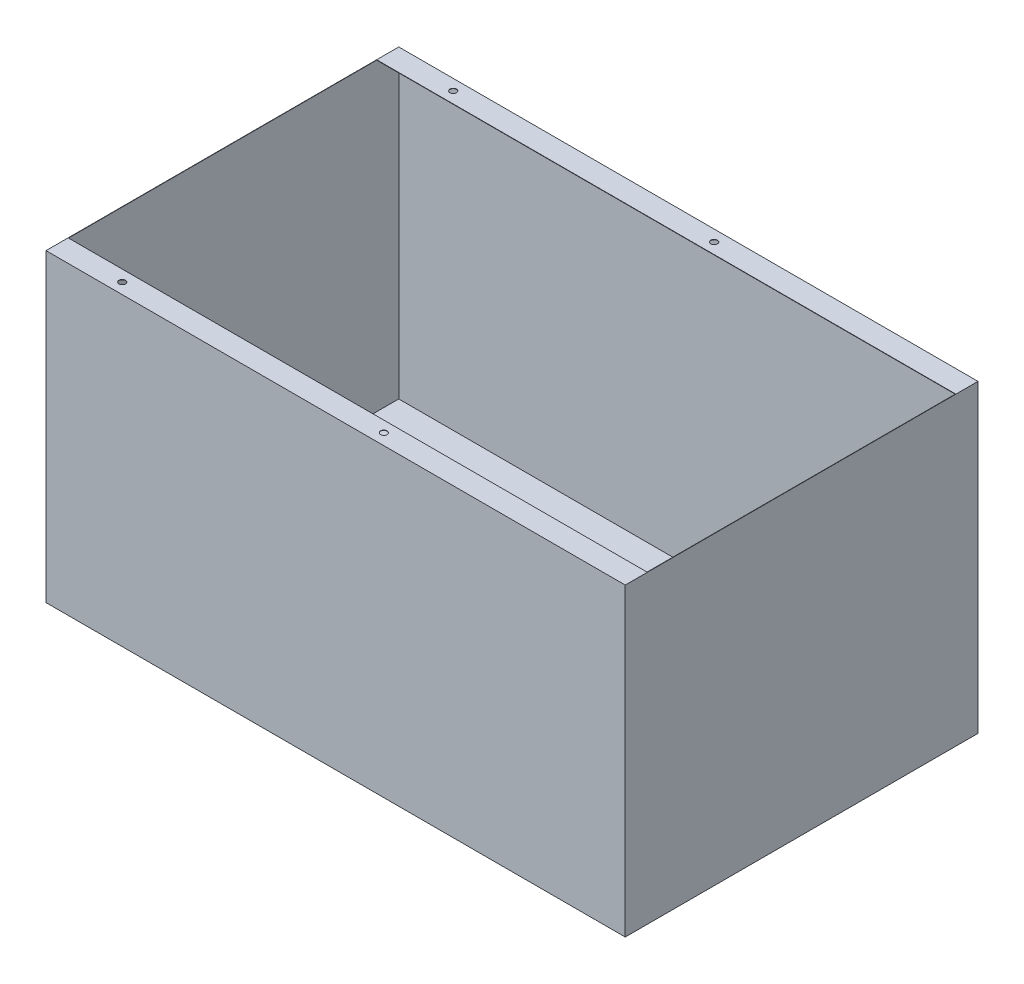
ISO-10303-21;
HEADER;
FILE_DESCRIPTION(('STEP AP214'),'2;1');
FILE_NAME('part.step','',(''),(''),'','','');
FILE_SCHEMA(('AUTOMOTIVE_DESIGN { 1 0 10303 214 1 1 1 1 }'));
ENDSEC;
DATA;
#1=APPLICATION_CONTEXT('core data for automotive mechanical design processes');
#2=APPLICATION_PROTOCOL_DEFINITION('international standard','automotive_design',2000,#1);
#3=PRODUCT_CONTEXT('',#1,'mechanical');
#4=PRODUCT('Part','Part','',(#3));
#5=PRODUCT_RELATED_PRODUCT_CATEGORY('part','',(#4));
#6=PRODUCT_DEFINITION_FORMATION('','',#4);
#7=PRODUCT_DEFINITION_CONTEXT('part definition',#1,'design');
#8=PRODUCT_DEFINITION('design','',#6,#7);
#9=PRODUCT_DEFINITION_SHAPE('','',#8);
#10=(LENGTH_UNIT() NAMED_UNIT(*) SI_UNIT(.MILLI.,.METRE.));
#11=(NAMED_UNIT(*) PLANE_ANGLE_UNIT() SI_UNIT($,.RADIAN.));
#12=(NAMED_UNIT(*) SI_UNIT($,.STERADIAN.) SOLID_ANGLE_UNIT());
#13=UNCERTAINTY_MEASURE_WITH_UNIT(LENGTH_MEASURE(1.E-05),#10,'distance_accuracy_value','');
#14=(GEOMETRIC_REPRESENTATION_CONTEXT(3) GLOBAL_UNCERTAINTY_ASSIGNED_CONTEXT((#13)) GLOBAL_UNIT_ASSIGNED_CONTEXT((#10,
#11,#12)) REPRESENTATION_CONTEXT('',''));
#15=CARTESIAN_POINT('',(0.,0.,0.));
#16=DIRECTION('',(0.,0.,1.));
#17=DIRECTION('',(1.,0.,0.));
#18=AXIS2_PLACEMENT_3D('',#15,#16,#17);
#19=CARTESIAN_POINT('',(-5974.47554082181,-1057.32100102968,1579.11799725683));
#20=DIRECTION('',(-1.,0.,0.));
#21=DIRECTION('',(0.,0.,1.));
#22=AXIS2_PLACEMENT_3D('',#19,#20,#21);
#23=PLANE('',#22);
#24=DIRECTION('',(0.,0.,1.));
#25=VECTOR('',#24,1.);
#26=CARTESIAN_POINT('',(-5974.47554082181,3448.63899348392,1256.53799725683));
#27=LINE('',#26,#25);
#28=CARTESIAN_POINT('',(-5974.47554082181,3448.63899348392,1256.53799725683));
#29=VERTEX_POINT('',#28);
#30=CARTESIAN_POINT('',(-5974.47554082181,3448.63899348392,1579.11799725683));
#31=VERTEX_POINT('',#30);
#32=EDGE_CURVE('E296',#29,#31,#27,.T.);
#33=ORIENTED_EDGE('',*,*,#32,.T.);
#34=DIRECTION('',(0.,1.,0.));
#35=VECTOR('',#34,1.);
#36=CARTESIAN_POINT('',(-5974.47554082181,-1057.32100102968,1579.11799725683));
#37=LINE('',#36,#35);
#38=CARTESIAN_POINT('',(-5974.47554082181,-1057.32100102968,1579.11799725683));
#39=VERTEX_POINT('',#38);
#40=EDGE_CURVE('E180',#39,#31,#37,.T.);
#41=ORIENTED_EDGE('',*,*,#40,.F.);
#42=DIRECTION('',(0.,0.,1.));
#43=VECTOR('',#42,1.);
#44=CARTESIAN_POINT('',(-5974.47554082181,-1057.32100102968,1579.11799725683));
#45=LINE('',#44,#43);
#46=CARTESIAN_POINT('',(-5974.47554082181,-1057.32100102968,-3636.51799725677));
#47=VERTEX_POINT('',#46);
#48=EDGE_CURVE('E165',#47,#39,#45,.T.);
#49=ORIENTED_EDGE('',*,*,#48,.F.);
#50=DIRECTION('',(0.,1.,0.));
#51=VECTOR('',#50,1.);
#52=CARTESIAN_POINT('',(-5974.47554082181,-1057.32100102968,-3636.51799725677));
#53=LINE('',#52,#51);
#54=CARTESIAN_POINT('',(-5974.47554082181,3448.63899348392,-3636.51799725677));
#55=VERTEX_POINT('',#54);
#56=EDGE_CURVE('E154',#47,#55,#53,.T.);
#57=ORIENTED_EDGE('',*,*,#56,.T.);
#58=DIRECTION('',(0.,0.,-1.));
#59=VECTOR('',#58,1.);
#60=CARTESIAN_POINT('',(-5974.47554082181,3448.63899348392,-3313.93799725677));
#61=LINE('',#60,#59);
#62=CARTESIAN_POINT('',(-5974.47554082181,3448.63899348392,-3313.93799725677));
#63=VERTEX_POINT('',#62);
#64=EDGE_CURVE('E133',#63,#55,#61,.T.);
#65=ORIENTED_EDGE('',*,*,#64,.F.);
#66=DIRECTION('',(0.,-1.,0.));
#67=VECTOR('',#66,1.);
#68=CARTESIAN_POINT('',(-5974.47554082181,3453.71899622712,-3313.93799725677));
#69=LINE('',#68,#67);
#70=CARTESIAN_POINT('',(-5974.47554082181,3453.71899622712,-3313.93799725677));
#71=VERTEX_POINT('',#70);
#72=EDGE_CURVE('E142',#71,#63,#69,.T.);
#73=ORIENTED_EDGE('',*,*,#72,.F.);
#74=DIRECTION('',(0.,0.,1.));
#75=VECTOR('',#74,1.);
#76=CARTESIAN_POINT('',(-5974.47554082181,3453.71899622712,1579.11799725683));
#77=LINE('',#76,#75);
#78=CARTESIAN_POINT('',(-5974.47554082181,3453.71899622712,1256.53799725683));
#79=VERTEX_POINT('',#78);
#80=EDGE_CURVE('E156',#71,#79,#77,.T.);
#81=ORIENTED_EDGE('',*,*,#80,.T.);
#82=DIRECTION('',(0.,1.,0.));
#83=VECTOR('',#82,1.);
#84=CARTESIAN_POINT('',(-5974.47554082181,3453.71899622712,1256.53799725683));
#85=LINE('',#84,#83);
#86=EDGE_CURVE('E56',#29,#79,#85,.T.);
#87=ORIENTED_EDGE('',*,*,#86,.F.);
#88=EDGE_LOOP('',(#33,#41,#49,#57,#65,#73,#81,#87));
#89=FACE_BOUND('',#88,.T.);
#90=ADVANCED_FACE('F38',(#89),#23,.F.);
#91=CARTESIAN_POINT('',(2595.99245369179,-1057.32100102968,1579.11799725683));
#92=DIRECTION('',(1.,0.,0.));
#93=DIRECTION('',(0.,0.,-1.));
#94=AXIS2_PLACEMENT_3D('',#91,#92,#93);
#95=PLANE('',#94);
#96=DIRECTION('',(0.,0.,1.));
#97=VECTOR('',#96,1.);
#98=CARTESIAN_POINT('',(2595.99245369179,3448.63899348392,1256.53799725683));
#99=LINE('',#98,#97);
#100=CARTESIAN_POINT('',(2595.99245369179,3448.63899348392,1256.53799725683));
#101=VERTEX_POINT('',#100);
#102=CARTESIAN_POINT('',(2595.99245369179,3448.63899348392,1579.11799725683));
#103=VERTEX_POINT('',#102);
#104=EDGE_CURVE('E64',#101,#103,#99,.T.);
#105=ORIENTED_EDGE('',*,*,#104,.F.);
#106=DIRECTION('',(0.,-1.,0.));
#107=VECTOR('',#106,1.);
#108=CARTESIAN_POINT('',(2595.99245369179,3453.71899622712,1256.53799725683));
#109=LINE('',#108,#107);
#110=CARTESIAN_POINT('',(2595.99245369179,3453.71899622712,1256.53799725683));
#111=VERTEX_POINT('',#110);
#112=EDGE_CURVE('E310',#111,#101,#109,.T.);
#113=ORIENTED_EDGE('',*,*,#112,.F.);
#114=DIRECTION('',(0.,0.,-1.));
#115=VECTOR('',#114,1.);
#116=CARTESIAN_POINT('',(2595.99245369179,3453.71899622712,1579.11799725683));
#117=LINE('',#116,#115);
#118=CARTESIAN_POINT('',(2595.99245369179,3453.71899622712,-3313.93799725677));
#119=VERTEX_POINT('',#118);
#120=EDGE_CURVE('E160',#111,#119,#117,.T.);
#121=ORIENTED_EDGE('',*,*,#120,.T.);
#122=DIRECTION('',(0.,1.,0.));
#123=VECTOR('',#122,1.);
#124=CARTESIAN_POINT('',(2595.99245369179,3453.71899622712,-3313.93799725677));
#125=LINE('',#124,#123);
#126=CARTESIAN_POINT('',(2595.99245369179,3448.63899348392,-3313.93799725677));
#127=VERTEX_POINT('',#126);
#128=EDGE_CURVE('E141',#127,#119,#125,.T.);
#129=ORIENTED_EDGE('',*,*,#128,.F.);
#130=DIRECTION('',(0.,0.,-1.));
#131=VECTOR('',#130,1.);
#132=CARTESIAN_POINT('',(2595.99245369179,3448.63899348392,-3313.93799725677));
#133=LINE('',#132,#131);
#134=CARTESIAN_POINT('',(2595.99245369179,3448.63899348392,-3636.51799725677));
#135=VERTEX_POINT('',#134);
#136=EDGE_CURVE('E136',#127,#135,#133,.T.);
#137=ORIENTED_EDGE('',*,*,#136,.T.);
#138=DIRECTION('',(0.,1.,0.));
#139=VECTOR('',#138,1.);
#140=CARTESIAN_POINT('',(2595.99245369179,-1057.32100102968,-3636.51799725677));
#141=LINE('',#140,#139);
#142=CARTESIAN_POINT('',(2595.99245369179,-1057.32100102968,-3636.51799725677));
#143=VERTEX_POINT('',#142);
#144=EDGE_CURVE('E187',#143,#135,#141,.T.);
#145=ORIENTED_EDGE('',*,*,#144,.F.);
#146=DIRECTION('',(0.,0.,-1.));
#147=VECTOR('',#146,1.);
#148=CARTESIAN_POINT('',(2595.99245369179,-1057.32100102968,1579.11799725683));
#149=LINE('',#148,#147);
#150=CARTESIAN_POINT('',(2595.99245369179,-1057.32100102968,1579.11799725683));
#151=VERTEX_POINT('',#150);
#152=EDGE_CURVE('E173',#151,#143,#149,.T.);
#153=ORIENTED_EDGE('',*,*,#152,.F.);
#154=DIRECTION('',(0.,1.,0.));
#155=VECTOR('',#154,1.);
#156=CARTESIAN_POINT('',(2595.99245369179,-1057.32100102968,1579.11799725683));
#157=LINE('',#156,#155);
#158=EDGE_CURVE('E191',#151,#103,#157,.T.);
#159=ORIENTED_EDGE('',*,*,#158,.T.);
#160=EDGE_LOOP('',(#105,#113,#121,#129,#137,#145,#153,#159));
#161=FACE_BOUND('',#160,.T.);
#162=ADVANCED_FACE('F260',(#161),#95,.F.);
#163=CARTESIAN_POINT('',(2595.99245369179,-1057.32100102968,1579.11799725683));
#164=DIRECTION('',(0.,0.,1.));
#165=DIRECTION('',(1.,0.,0.));
#166=AXIS2_PLACEMENT_3D('',#163,#164,#165);
#167=PLANE('',#166);
#168=DIRECTION('',(-1.,0.,0.));
#169=VECTOR('',#168,1.);
#170=CARTESIAN_POINT('',(2595.99245369179,3448.63899348392,1579.11799725683));
#171=LINE('',#170,#169);
#172=EDGE_CURVE('E306',#103,#31,#171,.T.);
#173=ORIENTED_EDGE('',*,*,#172,.F.);
#174=ORIENTED_EDGE('',*,*,#158,.F.);
#175=DIRECTION('',(1.,0.,0.));
#176=VECTOR('',#175,1.);
#177=CARTESIAN_POINT('',(2595.99245369179,-1057.32100102968,1579.11799725683));
#178=LINE('',#177,#176);
#179=EDGE_CURVE('E169',#39,#151,#178,.T.);
#180=ORIENTED_EDGE('',*,*,#179,.F.);
#181=ORIENTED_EDGE('',*,*,#40,.T.);
#182=EDGE_LOOP('',(#173,#174,#180,#181));
#183=FACE_BOUND('',#182,.T.);
#184=ADVANCED_FACE('F265',(#183),#167,.F.);
#185=CARTESIAN_POINT('',(2595.99245369179,-1057.32100102968,-3636.51799725677));
#186=DIRECTION('',(0.,0.,-1.));
#187=DIRECTION('',(-1.,0.,0.));
#188=AXIS2_PLACEMENT_3D('',#185,#186,#187);
#189=PLANE('',#188);
#190=DIRECTION('',(1.,0.,0.));
#191=VECTOR('',#190,1.);
#192=CARTESIAN_POINT('',(-5974.47554082181,3448.63899348392,-3636.51799725677));
#193=LINE('',#192,#191);
#194=EDGE_CURVE('E150',#55,#135,#193,.T.);
#195=ORIENTED_EDGE('',*,*,#194,.F.);
#196=ORIENTED_EDGE('',*,*,#56,.F.);
#197=DIRECTION('',(-1.,0.,0.));
#198=VECTOR('',#197,1.);
#199=CARTESIAN_POINT('',(2595.99245369179,-1057.32100102968,-3636.51799725677));
#200=LINE('',#199,#198);
#201=EDGE_CURVE('E177',#143,#47,#200,.T.);
#202=ORIENTED_EDGE('',*,*,#201,.F.);
#203=ORIENTED_EDGE('',*,*,#144,.T.);
#204=EDGE_LOOP('',(#195,#196,#202,#203));
#205=FACE_BOUND('',#204,.T.);
#206=ADVANCED_FACE('F285',(#205),#189,.F.);
#207=CARTESIAN_POINT('',(-5979.55554356501,-1062.40100377288,1584.19800000003));
#208=DIRECTION('',(0.,0.,1.));
#209=DIRECTION('',(1.,0.,0.));
#210=AXIS2_PLACEMENT_3D('',#207,#208,#209);
#211=PLANE('',#210);
#212=DIRECTION('',(0.,-1.,0.));
#213=VECTOR('',#212,1.);
#214=CARTESIAN_POINT('',(2601.07245643499,-1062.40100377288,1584.19800000003));
#215=LINE('',#214,#213);
#216=CARTESIAN_POINT('',(2601.07245643499,3453.71899622712,1584.19800000003));
#217=VERTEX_POINT('',#216);
#218=CARTESIAN_POINT('',(2601.07245643499,-1062.40100377288,1584.19800000003));
#219=VERTEX_POINT('',#218);
#220=EDGE_CURVE('E186',#217,#219,#215,.T.);
#221=ORIENTED_EDGE('',*,*,#220,.F.);
#222=DIRECTION('',(1.,0.,0.));
#223=VECTOR('',#222,1.);
#224=CARTESIAN_POINT('',(-5979.55554356501,3453.71899622712,1584.19800000003));
#225=LINE('',#224,#223);
#226=CARTESIAN_POINT('',(-5979.55554356501,3453.71899622712,1584.19800000003));
#227=VERTEX_POINT('',#226);
#228=EDGE_CURVE('E11',#227,#217,#225,.T.);
#229=ORIENTED_EDGE('',*,*,#228,.F.);
#230=DIRECTION('',(0.,-1.,0.));
#231=VECTOR('',#230,1.);
#232=CARTESIAN_POINT('',(-5979.55554356501,-1062.40100377288,1584.19800000003));
#233=LINE('',#232,#231);
#234=CARTESIAN_POINT('',(-5979.55554356501,-1062.40100377288,1584.19800000003));
#235=VERTEX_POINT('',#234);
#236=EDGE_CURVE('E197',#227,#235,#233,.T.);
#237=ORIENTED_EDGE('',*,*,#236,.T.);
#238=DIRECTION('',(1.,0.,0.));
#239=VECTOR('',#238,1.);
#240=CARTESIAN_POINT('',(-5979.55554356501,-1062.40100377288,1584.19800000003));
#241=LINE('',#240,#239);
#242=EDGE_CURVE('E42',#235,#219,#241,.T.);
#243=ORIENTED_EDGE('',*,*,#242,.T.);
#244=EDGE_LOOP('',(#221,#229,#237,#243));
#245=FACE_BOUND('',#244,.T.);
#246=ADVANCED_FACE('F40',(#245),#211,.T.);
#247=CARTESIAN_POINT('',(-5979.55554356501,3453.71899622712,1584.19800000003));
#248=DIRECTION('',(0.,1.,0.));
#249=DIRECTION('',(0.,0.,1.));
#250=AXIS2_PLACEMENT_3D('',#247,#248,#249);
#251=PLANE('',#250);
#252=CARTESIAN_POINT('',(-5011.81554356501,3453.71899622712,1422.90800000003));
#253=DIRECTION('',(0.,1.,0.));
#254=DIRECTION('',(0.,0.,1.));
#255=AXIS2_PLACEMENT_3D('',#252,#253,#254);
#256=CIRCLE('',#255,48.3870000000001);
#257=CARTESIAN_POINT('',(-5011.81554356501,3453.71899622712,1471.29500000003));
#258=VERTEX_POINT('',#257);
#259=EDGE_CURVE('E336',#258,#258,#256,.T.);
#260=ORIENTED_EDGE('',*,*,#259,.F.);
#261=EDGE_LOOP('',(#260));
#262=FACE_BOUND('',#261,.T.);
#263=CARTESIAN_POINT('',(-5011.81554356501,3453.71899622712,-3480.30799999997));
#264=DIRECTION('',(0.,1.,0.));
#265=DIRECTION('',(0.,0.,1.));
#266=AXIS2_PLACEMENT_3D('',#263,#264,#265);
#267=CIRCLE('',#266,48.3870000000001);
#268=CARTESIAN_POINT('',(-5011.81554356501,3453.71899622712,-3431.92099999997));
#269=VERTEX_POINT('',#268);
#270=EDGE_CURVE('E335',#269,#269,#267,.T.);
#271=ORIENTED_EDGE('',*,*,#270,.F.);
#272=EDGE_LOOP('',(#271));
#273=FACE_BOUND('',#272,.T.);
#274=CARTESIAN_POINT('',(-1140.85554356501,3453.71899622712,-3475.22799725677));
#275=DIRECTION('',(0.,1.,0.));
#276=DIRECTION('',(0.,0.,1.));
#277=AXIS2_PLACEMENT_3D('',#274,#275,#276);
#278=CIRCLE('',#277,48.3870000000001);
#279=CARTESIAN_POINT('',(-1140.85554356501,3453.71899622712,-3426.84099725677));
#280=VERTEX_POINT('',#279);
#281=EDGE_CURVE('E344',#280,#280,#278,.T.);
#282=ORIENTED_EDGE('',*,*,#281,.F.);
#283=EDGE_LOOP('',(#282));
#284=FACE_BOUND('',#283,.T.);
#285=CARTESIAN_POINT('',(-1140.85554356501,3453.71899622712,1417.82799725683));
#286=DIRECTION('',(0.,1.,0.));
#287=DIRECTION('',(0.,0.,1.));
#288=AXIS2_PLACEMENT_3D('',#285,#286,#287);
#289=CIRCLE('',#288,48.3870000000001);
#290=CARTESIAN_POINT('',(-1140.85554356501,3453.71899622712,1466.21499725683));
#291=VERTEX_POINT('',#290);
#292=EDGE_CURVE('E326',#291,#291,#289,.T.);
#293=ORIENTED_EDGE('',*,*,#292,.F.);
#294=EDGE_LOOP('',(#293));
#295=FACE_BOUND('',#294,.T.);
#296=ORIENTED_EDGE('',*,*,#120,.F.);
#297=DIRECTION('',(1.,0.,0.));
#298=VECTOR('',#297,1.);
#299=CARTESIAN_POINT('',(2595.99245369179,3453.71899622712,1256.53799725683));
#300=LINE('',#299,#298);
#301=EDGE_CURVE('E305',#79,#111,#300,.T.);
#302=ORIENTED_EDGE('',*,*,#301,.F.);
#303=ORIENTED_EDGE('',*,*,#80,.F.);
#304=DIRECTION('',(-1.,0.,0.));
#305=VECTOR('',#304,1.);
#306=CARTESIAN_POINT('',(-5974.47554082181,3453.71899622712,-3313.93799725677));
#307=LINE('',#306,#305);
#308=EDGE_CURVE('E147',#119,#71,#307,.T.);
#309=ORIENTED_EDGE('',*,*,#308,.F.);
#310=EDGE_LOOP('',(#296,#302,#303,#309));
#311=FACE_BOUND('',#310,.T.);
#312=DIRECTION('',(0.,0.,1.));
#313=VECTOR('',#312,1.);
#314=CARTESIAN_POINT('',(2601.07245643499,3453.71899622712,1584.19800000003));
#315=LINE('',#314,#313);
#316=CARTESIAN_POINT('',(2601.07245643499,3453.71899622712,-3641.59799999997));
#317=VERTEX_POINT('',#316);
#318=EDGE_CURVE('E202',#317,#217,#315,.T.);
#319=ORIENTED_EDGE('',*,*,#318,.F.);
#320=DIRECTION('',(1.,0.,0.));
#321=VECTOR('',#320,1.);
#322=CARTESIAN_POINT('',(-5979.55554356501,3453.71899622712,-3641.59799999997));
#323=LINE('',#322,#321);
#324=CARTESIAN_POINT('',(-5979.55554356501,3453.71899622712,-3641.59799999997));
#325=VERTEX_POINT('',#324);
#326=EDGE_CURVE('E48',#325,#317,#323,.T.);
#327=ORIENTED_EDGE('',*,*,#326,.F.);
#328=DIRECTION('',(0.,0.,1.));
#329=VECTOR('',#328,1.);
#330=CARTESIAN_POINT('',(-5979.55554356501,3453.71899622712,1584.19800000003));
#331=LINE('',#330,#329);
#332=EDGE_CURVE('E210',#325,#227,#331,.T.);
#333=ORIENTED_EDGE('',*,*,#332,.T.);
#334=ORIENTED_EDGE('',*,*,#228,.T.);
#335=EDGE_LOOP('',(#319,#327,#333,#334));
#336=FACE_BOUND('',#335,.T.);
#337=ADVANCED_FACE('F244',(#262,#273,#284,#295,#311,#336),#251,.T.);
#338=CARTESIAN_POINT('',(-5979.55554356501,-1062.40100377288,-3641.59799999997));
#339=DIRECTION('',(0.,0.,-1.));
#340=DIRECTION('',(-1.,0.,0.));
#341=AXIS2_PLACEMENT_3D('',#338,#339,#340);
#342=PLANE('',#341);
#343=DIRECTION('',(0.,1.,0.));
#344=VECTOR('',#343,1.);
#345=CARTESIAN_POINT('',(2601.07245643499,-1062.40100377288,-3641.59799999997));
#346=LINE('',#345,#344);
#347=CARTESIAN_POINT('',(2601.07245643499,-1062.40100377288,-3641.59799999997));
#348=VERTEX_POINT('',#347);
#349=EDGE_CURVE('E221',#348,#317,#346,.T.);
#350=ORIENTED_EDGE('',*,*,#349,.F.);
#351=DIRECTION('',(1.,0.,0.));
#352=VECTOR('',#351,1.);
#353=CARTESIAN_POINT('',(-5979.55554356501,-1062.40100377288,-3641.59799999997));
#354=LINE('',#353,#352);
#355=CARTESIAN_POINT('',(-5979.55554356501,-1062.40100377288,-3641.59799999997));
#356=VERTEX_POINT('',#355);
#357=EDGE_CURVE('E229',#356,#348,#354,.T.);
#358=ORIENTED_EDGE('',*,*,#357,.F.);
#359=DIRECTION('',(0.,1.,0.));
#360=VECTOR('',#359,1.);
#361=CARTESIAN_POINT('',(-5979.55554356501,-1062.40100377288,-3641.59799999997));
#362=LINE('',#361,#360);
#363=EDGE_CURVE('E206',#356,#325,#362,.T.);
#364=ORIENTED_EDGE('',*,*,#363,.T.);
#365=ORIENTED_EDGE('',*,*,#326,.T.);
#366=EDGE_LOOP('',(#350,#358,#364,#365));
#367=FACE_BOUND('',#366,.T.);
#368=ADVANCED_FACE('F250',(#367),#342,.T.);
#369=CARTESIAN_POINT('',(-5979.55554356501,-1062.40100377288,1584.19800000003));
#370=DIRECTION('',(0.,-1.,0.));
#371=DIRECTION('',(0.,0.,-1.));
#372=AXIS2_PLACEMENT_3D('',#369,#370,#371);
#373=PLANE('',#372);
#374=DIRECTION('',(0.,0.,-1.));
#375=VECTOR('',#374,1.);
#376=CARTESIAN_POINT('',(2601.07245643499,-1062.40100377288,1584.19800000003));
#377=LINE('',#376,#375);
#378=EDGE_CURVE('E217',#219,#348,#377,.T.);
#379=ORIENTED_EDGE('',*,*,#378,.F.);
#380=ORIENTED_EDGE('',*,*,#242,.F.);
#381=DIRECTION('',(0.,0.,-1.));
#382=VECTOR('',#381,1.);
#383=CARTESIAN_POINT('',(-5979.55554356501,-1062.40100377288,1584.19800000003));
#384=LINE('',#383,#382);
#385=EDGE_CURVE('E201',#235,#356,#384,.T.);
#386=ORIENTED_EDGE('',*,*,#385,.T.);
#387=ORIENTED_EDGE('',*,*,#357,.T.);
#388=EDGE_LOOP('',(#379,#380,#386,#387));
#389=FACE_BOUND('',#388,.T.);
#390=ADVANCED_FACE('F239',(#389),#373,.T.);
#391=CARTESIAN_POINT('',(-5979.55554356501,-1062.40100377288,1584.19800000003));
#392=DIRECTION('',(-1.,0.,0.));
#393=DIRECTION('',(0.,0.,1.));
#394=AXIS2_PLACEMENT_3D('',#391,#392,#393);
#395=PLANE('',#394);
#396=ORIENTED_EDGE('',*,*,#236,.F.);
#397=ORIENTED_EDGE('',*,*,#332,.F.);
#398=ORIENTED_EDGE('',*,*,#363,.F.);
#399=ORIENTED_EDGE('',*,*,#385,.F.);
#400=EDGE_LOOP('',(#396,#397,#398,#399));
#401=FACE_BOUND('',#400,.T.);
#402=ADVANCED_FACE('F247',(#401),#395,.T.);
#403=CARTESIAN_POINT('',(2601.07245643499,-1062.40100377288,1584.19800000003));
#404=DIRECTION('',(-1.,0.,0.));
#405=DIRECTION('',(0.,0.,1.));
#406=AXIS2_PLACEMENT_3D('',#403,#404,#405);
#407=PLANE('',#406);
#408=ORIENTED_EDGE('',*,*,#220,.T.);
#409=ORIENTED_EDGE('',*,*,#378,.T.);
#410=ORIENTED_EDGE('',*,*,#349,.T.);
#411=ORIENTED_EDGE('',*,*,#318,.T.);
#412=EDGE_LOOP('',(#408,#409,#410,#411));
#413=FACE_BOUND('',#412,.T.);
#414=ADVANCED_FACE('F241',(#413),#407,.F.);
#415=CARTESIAN_POINT('',(2601.07245643499,-1057.32100102968,1584.19800000003));
#416=DIRECTION('',(0.,1.,0.));
#417=DIRECTION('',(0.,0.,1.));
#418=AXIS2_PLACEMENT_3D('',#415,#416,#417);
#419=PLANE('',#418);
#420=ORIENTED_EDGE('',*,*,#48,.T.);
#421=ORIENTED_EDGE('',*,*,#179,.T.);
#422=ORIENTED_EDGE('',*,*,#152,.T.);
#423=ORIENTED_EDGE('',*,*,#201,.T.);
#424=EDGE_LOOP('',(#420,#421,#422,#423));
#425=FACE_BOUND('',#424,.T.);
#426=ADVANCED_FACE('F272',(#425),#419,.T.);
#427=CARTESIAN_POINT('',(-5974.47554082181,3448.63899348392,-3313.93799725677));
#428=DIRECTION('',(0.,1.,0.));
#429=DIRECTION('',(0.,0.,1.));
#430=AXIS2_PLACEMENT_3D('',#427,#428,#429);
#431=PLANE('',#430);
#432=CARTESIAN_POINT('',(-5011.81554356501,3448.63899348392,-3480.30799999997));
#433=DIRECTION('',(0.,1.,0.));
#434=DIRECTION('',(0.,0.,1.));
#435=AXIS2_PLACEMENT_3D('',#432,#433,#434);
#436=CIRCLE('',#435,48.3870000000001);
#437=CARTESIAN_POINT('',(-5011.81554356501,3448.63899348392,-3431.92099999997));
#438=VERTEX_POINT('',#437);
#439=EDGE_CURVE('E340',#438,#438,#436,.F.);
#440=ORIENTED_EDGE('',*,*,#439,.F.);
#441=EDGE_LOOP('',(#440));
#442=FACE_BOUND('',#441,.T.);
#443=CARTESIAN_POINT('',(-1140.85554356501,3448.63899348392,-3475.22799725677));
#444=DIRECTION('',(0.,1.,0.));
#445=DIRECTION('',(0.,0.,1.));
#446=AXIS2_PLACEMENT_3D('',#443,#444,#445);
#447=CIRCLE('',#446,48.3870000000001);
#448=CARTESIAN_POINT('',(-1140.85554356501,3448.63899348392,-3426.84099725677));
#449=VERTEX_POINT('',#448);
#450=EDGE_CURVE('E330',#449,#449,#447,.F.);
#451=ORIENTED_EDGE('',*,*,#450,.F.);
#452=EDGE_LOOP('',(#451));
#453=FACE_BOUND('',#452,.T.);
#454=ORIENTED_EDGE('',*,*,#194,.T.);
#455=ORIENTED_EDGE('',*,*,#136,.F.);
#456=DIRECTION('',(1.,0.,0.));
#457=VECTOR('',#456,1.);
#458=CARTESIAN_POINT('',(-5974.47554082181,3448.63899348392,-3313.93799725677));
#459=LINE('',#458,#457);
#460=EDGE_CURVE('E129',#63,#127,#459,.T.);
#461=ORIENTED_EDGE('',*,*,#460,.F.);
#462=ORIENTED_EDGE('',*,*,#64,.T.);
#463=EDGE_LOOP('',(#454,#455,#461,#462));
#464=FACE_BOUND('',#463,.T.);
#465=ADVANCED_FACE('F131',(#442,#453,#464),#431,.F.);
#466=CARTESIAN_POINT('',(2601.07245643499,-1062.40100377288,-3313.93799725677));
#467=DIRECTION('',(0.,0.,1.));
#468=DIRECTION('',(1.,0.,0.));
#469=AXIS2_PLACEMENT_3D('',#466,#467,#468);
#470=PLANE('',#469);
#471=ORIENTED_EDGE('',*,*,#72,.T.);
#472=ORIENTED_EDGE('',*,*,#460,.T.);
#473=ORIENTED_EDGE('',*,*,#128,.T.);
#474=ORIENTED_EDGE('',*,*,#308,.T.);
#475=EDGE_LOOP('',(#471,#472,#473,#474));
#476=FACE_BOUND('',#475,.T.);
#477=ADVANCED_FACE('F145',(#476),#470,.T.);
#478=CARTESIAN_POINT('',(2595.99245369179,3448.63899348392,1256.53799725683));
#479=DIRECTION('',(0.,1.,0.));
#480=DIRECTION('',(0.,0.,1.));
#481=AXIS2_PLACEMENT_3D('',#478,#479,#480);
#482=PLANE('',#481);
#483=CARTESIAN_POINT('',(-5011.81554356501,3448.63899348392,1422.90800000003));
#484=DIRECTION('',(0.,1.,0.));
#485=DIRECTION('',(0.,0.,1.));
#486=AXIS2_PLACEMENT_3D('',#483,#484,#485);
#487=CIRCLE('',#486,48.3870000000001);
#488=CARTESIAN_POINT('',(-5011.81554356501,3448.63899348392,1471.29500000003));
#489=VERTEX_POINT('',#488);
#490=EDGE_CURVE('E331',#489,#489,#487,.F.);
#491=ORIENTED_EDGE('',*,*,#490,.F.);
#492=EDGE_LOOP('',(#491));
#493=FACE_BOUND('',#492,.T.);
#494=CARTESIAN_POINT('',(-1140.85554356501,3448.63899348392,1417.82799725683));
#495=DIRECTION('',(0.,1.,0.));
#496=DIRECTION('',(0.,0.,1.));
#497=AXIS2_PLACEMENT_3D('',#494,#495,#496);
#498=CIRCLE('',#497,48.3870000000001);
#499=CARTESIAN_POINT('',(-1140.85554356501,3448.63899348392,1466.21499725683));
#500=VERTEX_POINT('',#499);
#501=EDGE_CURVE('E311',#500,#500,#498,.F.);
#502=ORIENTED_EDGE('',*,*,#501,.F.);
#503=EDGE_LOOP('',(#502));
#504=FACE_BOUND('',#503,.T.);
#505=ORIENTED_EDGE('',*,*,#172,.T.);
#506=ORIENTED_EDGE('',*,*,#32,.F.);
#507=DIRECTION('',(-1.,0.,0.));
#508=VECTOR('',#507,1.);
#509=CARTESIAN_POINT('',(2595.99245369179,3448.63899348392,1256.53799725683));
#510=LINE('',#509,#508);
#511=EDGE_CURVE('E317',#101,#29,#510,.T.);
#512=ORIENTED_EDGE('',*,*,#511,.F.);
#513=ORIENTED_EDGE('',*,*,#104,.T.);
#514=EDGE_LOOP('',(#505,#506,#512,#513));
#515=FACE_BOUND('',#514,.T.);
#516=ADVANCED_FACE('F367',(#493,#504,#515),#482,.F.);
#517=CARTESIAN_POINT('',(2601.07245643499,-1062.40100377288,1256.53799725683));
#518=DIRECTION('',(0.,0.,-1.));
#519=DIRECTION('',(-1.,0.,0.));
#520=AXIS2_PLACEMENT_3D('',#517,#518,#519);
#521=PLANE('',#520);
#522=ORIENTED_EDGE('',*,*,#112,.T.);
#523=ORIENTED_EDGE('',*,*,#511,.T.);
#524=ORIENTED_EDGE('',*,*,#86,.T.);
#525=ORIENTED_EDGE('',*,*,#301,.T.);
#526=EDGE_LOOP('',(#522,#523,#524,#525));
#527=FACE_BOUND('',#526,.T.);
#528=ADVANCED_FACE('F364',(#527),#521,.T.);
#529=CARTESIAN_POINT('',(-1140.85554356501,-1062.40354377288,1417.82799725683));
#530=DIRECTION('',(0.,1.,0.));
#531=DIRECTION('',(0.,0.,1.));
#532=AXIS2_PLACEMENT_3D('',#529,#530,#531);
#533=CYLINDRICAL_SURFACE('',#532,48.3870000000001);
#534=ORIENTED_EDGE('',*,*,#292,.T.);
#535=EDGE_LOOP('',(#534));
#536=FACE_BOUND('',#535,.T.);
#537=ORIENTED_EDGE('',*,*,#501,.T.);
#538=EDGE_LOOP('',(#537));
#539=FACE_BOUND('',#538,.T.);
#540=ADVANCED_FACE('F377',(#536,#539),#533,.F.);
#541=CARTESIAN_POINT('',(-5011.81554356501,-1062.40354377288,1422.90800000003));
#542=DIRECTION('',(0.,1.,0.));
#543=DIRECTION('',(0.,0.,1.));
#544=AXIS2_PLACEMENT_3D('',#541,#542,#543);
#545=CYLINDRICAL_SURFACE('',#544,48.3870000000001);
#546=ORIENTED_EDGE('',*,*,#259,.T.);
#547=EDGE_LOOP('',(#546));
#548=FACE_BOUND('',#547,.T.);
#549=ORIENTED_EDGE('',*,*,#490,.T.);
#550=EDGE_LOOP('',(#549));
#551=FACE_BOUND('',#550,.T.);
#552=ADVANCED_FACE('F384',(#548,#551),#545,.F.);
#553=CARTESIAN_POINT('',(-1140.85554356501,-1062.40354377288,-3475.22799725677));
#554=DIRECTION('',(0.,1.,0.));
#555=DIRECTION('',(0.,0.,1.));
#556=AXIS2_PLACEMENT_3D('',#553,#554,#555);
#557=CYLINDRICAL_SURFACE('',#556,48.3870000000001);
#558=ORIENTED_EDGE('',*,*,#281,.T.);
#559=EDGE_LOOP('',(#558));
#560=FACE_BOUND('',#559,.T.);
#561=ORIENTED_EDGE('',*,*,#450,.T.);
#562=EDGE_LOOP('',(#561));
#563=FACE_BOUND('',#562,.T.);
#564=ADVANCED_FACE('F355',(#560,#563),#557,.F.);
#565=CARTESIAN_POINT('',(-5011.81554356501,-1062.40354377288,-3480.30799999997));
#566=DIRECTION('',(0.,1.,0.));
#567=DIRECTION('',(0.,0.,1.));
#568=AXIS2_PLACEMENT_3D('',#565,#566,#567);
#569=CYLINDRICAL_SURFACE('',#568,48.3870000000001);
#570=ORIENTED_EDGE('',*,*,#270,.T.);
#571=EDGE_LOOP('',(#570));
#572=FACE_BOUND('',#571,.T.);
#573=ORIENTED_EDGE('',*,*,#439,.T.);
#574=EDGE_LOOP('',(#573));
#575=FACE_BOUND('',#574,.T.);
#576=ADVANCED_FACE('F389',(#572,#575),#569,.F.);
#577=CLOSED_SHELL('',(#90,#162,#184,#206,#246,#337,#368,#390,#402,#414,#426,#465,#477,#516,#528,
#540,#552,#564,#576));
#578=MANIFOLD_SOLID_BREP('B2',#577);
#579=ADVANCED_BREP_SHAPE_REPRESENTATION('',(#18,#578),#14);
#580=SHAPE_DEFINITION_REPRESENTATION(#9,#579);
ENDSEC;
END-ISO-10303-21;
